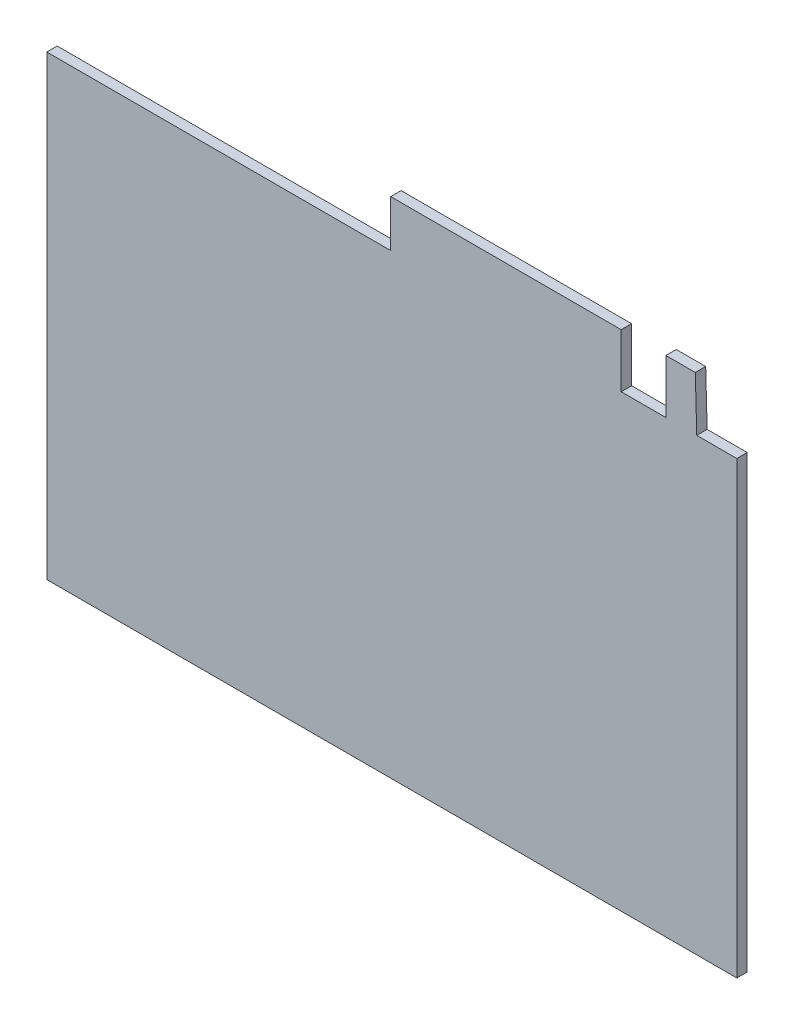
ISO-10303-21;
HEADER;
FILE_DESCRIPTION(('STEP AP214'),'2;1');
FILE_NAME('part.step','',(''),(''),'','','');
FILE_SCHEMA(('AUTOMOTIVE_DESIGN { 1 0 10303 214 1 1 1 1 }'));
ENDSEC;
DATA;
#1=APPLICATION_CONTEXT('core data for automotive mechanical design processes');
#2=APPLICATION_PROTOCOL_DEFINITION('international standard','automotive_design',2000,#1);
#3=PRODUCT_CONTEXT('',#1,'mechanical');
#4=PRODUCT('Part','Part','',(#3));
#5=PRODUCT_RELATED_PRODUCT_CATEGORY('part','',(#4));
#6=PRODUCT_DEFINITION_FORMATION('','',#4);
#7=PRODUCT_DEFINITION_CONTEXT('part definition',#1,'design');
#8=PRODUCT_DEFINITION('design','',#6,#7);
#9=PRODUCT_DEFINITION_SHAPE('','',#8);
#10=(LENGTH_UNIT() NAMED_UNIT(*) SI_UNIT(.MILLI.,.METRE.));
#11=(NAMED_UNIT(*) PLANE_ANGLE_UNIT() SI_UNIT($,.RADIAN.));
#12=(NAMED_UNIT(*) SI_UNIT($,.STERADIAN.) SOLID_ANGLE_UNIT());
#13=UNCERTAINTY_MEASURE_WITH_UNIT(LENGTH_MEASURE(1.E-05),#10,'distance_accuracy_value','');
#14=(GEOMETRIC_REPRESENTATION_CONTEXT(3) GLOBAL_UNCERTAINTY_ASSIGNED_CONTEXT((#13)) GLOBAL_UNIT_ASSIGNED_CONTEXT((#10,
#11,#12)) REPRESENTATION_CONTEXT('',''));
#15=CARTESIAN_POINT('',(0.,0.,0.));
#16=DIRECTION('',(0.,0.,1.));
#17=DIRECTION('',(1.,0.,0.));
#18=AXIS2_PLACEMENT_3D('',#15,#16,#17);
#19=CARTESIAN_POINT('',(28.5714285714286,236.06020224505,6.));
#20=DIRECTION('',(-1.,0.,0.));
#21=DIRECTION('',(0.,0.,1.));
#22=AXIS2_PLACEMENT_3D('',#19,#20,#21);
#23=PLANE('',#22);
#24=DIRECTION('',(0.,1.,0.));
#25=VECTOR('',#24,1.);
#26=CARTESIAN_POINT('',(28.5714285714286,236.06020224505,0.));
#27=LINE('',#26,#25);
#28=CARTESIAN_POINT('',(28.5714285714282,-22.8952380952381,0.));
#29=VERTEX_POINT('',#28);
#30=CARTESIAN_POINT('',(28.5714285714286,237.051840480238,0.));
#31=VERTEX_POINT('',#30);
#32=EDGE_CURVE('E96',#29,#31,#27,.T.);
#33=ORIENTED_EDGE('',*,*,#32,.T.);
#34=DIRECTION('',(0.,0.,-1.));
#35=VECTOR('',#34,1.);
#36=CARTESIAN_POINT('',(28.5714285714286,237.051840480238,6.));
#37=LINE('',#36,#35);
#38=CARTESIAN_POINT('',(28.5714285714286,237.051840480238,6.));
#39=VERTEX_POINT('',#38);
#40=EDGE_CURVE('E11',#39,#31,#37,.T.);
#41=ORIENTED_EDGE('',*,*,#40,.F.);
#42=DIRECTION('',(0.,1.,0.));
#43=VECTOR('',#42,1.);
#44=CARTESIAN_POINT('',(28.5714285714282,-22.8952380952381,6.));
#45=LINE('',#44,#43);
#46=CARTESIAN_POINT('',(28.5714285714282,-22.8952380952381,6.));
#47=VERTEX_POINT('',#46);
#48=EDGE_CURVE('E102',#47,#39,#45,.T.);
#49=ORIENTED_EDGE('',*,*,#48,.F.);
#50=DIRECTION('',(0.,0.,-1.));
#51=VECTOR('',#50,1.);
#52=CARTESIAN_POINT('',(28.5714285714282,-22.8952380952381,6.));
#53=LINE('',#52,#51);
#54=EDGE_CURVE('E148',#47,#29,#53,.T.);
#55=ORIENTED_EDGE('',*,*,#54,.T.);
#56=EDGE_LOOP('',(#33,#41,#49,#55));
#57=FACE_BOUND('',#56,.T.);
#58=ADVANCED_FACE('F32',(#57),#23,.F.);
#59=CARTESIAN_POINT('',(28.5714285714286,237.051840480238,6.));
#60=DIRECTION('',(0.,-1.,0.));
#61=DIRECTION('',(0.,0.,-1.));
#62=AXIS2_PLACEMENT_3D('',#59,#60,#61);
#63=PLANE('',#62);
#64=DIRECTION('',(-1.,0.,0.));
#65=VECTOR('',#64,1.);
#66=CARTESIAN_POINT('',(28.5714285714286,237.051840480238,0.));
#67=LINE('',#66,#65);
#68=CARTESIAN_POINT('',(5.41548643614652,237.051840480238,0.));
#69=VERTEX_POINT('',#68);
#70=EDGE_CURVE('E153',#31,#69,#67,.T.);
#71=ORIENTED_EDGE('',*,*,#70,.T.);
#72=DIRECTION('',(0.,0.,-1.));
#73=VECTOR('',#72,1.);
#74=CARTESIAN_POINT('',(5.41548643614652,237.051840480238,6.));
#75=LINE('',#74,#73);
#76=CARTESIAN_POINT('',(5.41548643614652,237.051840480238,6.));
#77=VERTEX_POINT('',#76);
#78=EDGE_CURVE('E40',#77,#69,#75,.T.);
#79=ORIENTED_EDGE('',*,*,#78,.F.);
#80=DIRECTION('',(-1.,0.,0.));
#81=VECTOR('',#80,1.);
#82=CARTESIAN_POINT('',(28.5714285714286,237.051840480238,6.));
#83=LINE('',#82,#81);
#84=EDGE_CURVE('E241',#39,#77,#83,.T.);
#85=ORIENTED_EDGE('',*,*,#84,.F.);
#86=ORIENTED_EDGE('',*,*,#40,.T.);
#87=EDGE_LOOP('',(#71,#79,#85,#86));
#88=FACE_BOUND('',#87,.T.);
#89=ADVANCED_FACE('F244',(#88),#63,.F.);
#90=CARTESIAN_POINT('',(5.41548643614652,237.051840480238,6.));
#91=DIRECTION('',(-0.99963079383079,-0.0271712352539165,0.));
#92=DIRECTION('',(0.0271712352539165,-0.99963079383079,0.));
#93=AXIS2_PLACEMENT_3D('',#90,#91,#92);
#94=PLANE('',#93);
#95=DIRECTION('',(-0.0271712352539165,0.999630793830791,0.));
#96=VECTOR('',#95,1.);
#97=CARTESIAN_POINT('',(5.41548643614652,237.051840480238,0.));
#98=LINE('',#97,#96);
#99=CARTESIAN_POINT('',(4.57142857142857,268.104761904762,0.));
#100=VERTEX_POINT('',#99);
#101=EDGE_CURVE('E155',#69,#100,#98,.T.);
#102=ORIENTED_EDGE('',*,*,#101,.T.);
#103=DIRECTION('',(0.,0.,-1.));
#104=VECTOR('',#103,1.);
#105=CARTESIAN_POINT('',(4.57142857142857,268.104761904762,6.));
#106=LINE('',#105,#104);
#107=CARTESIAN_POINT('',(4.57142857142857,268.104761904762,6.));
#108=VERTEX_POINT('',#107);
#109=EDGE_CURVE('E192',#108,#100,#106,.T.);
#110=ORIENTED_EDGE('',*,*,#109,.F.);
#111=DIRECTION('',(-0.0271712352539165,0.999630793830791,0.));
#112=VECTOR('',#111,1.);
#113=CARTESIAN_POINT('',(5.41548643614652,237.051840480238,6.));
#114=LINE('',#113,#112);
#115=EDGE_CURVE('E201',#77,#108,#114,.T.);
#116=ORIENTED_EDGE('',*,*,#115,.F.);
#117=ORIENTED_EDGE('',*,*,#78,.T.);
#118=EDGE_LOOP('',(#102,#110,#116,#117));
#119=FACE_BOUND('',#118,.T.);
#120=ADVANCED_FACE('F199',(#119),#94,.F.);
#121=CARTESIAN_POINT('',(4.57142857142857,268.104761904762,6.));
#122=DIRECTION('',(0.,-1.,0.));
#123=DIRECTION('',(0.,0.,-1.));
#124=AXIS2_PLACEMENT_3D('',#121,#122,#123);
#125=PLANE('',#124);
#126=DIRECTION('',(-1.,0.,0.));
#127=VECTOR('',#126,1.);
#128=CARTESIAN_POINT('',(4.57142857142857,268.104761904762,0.));
#129=LINE('',#128,#127);
#130=CARTESIAN_POINT('',(-12.4285714285714,268.104761904762,0.));
#131=VERTEX_POINT('',#130);
#132=EDGE_CURVE('E157',#100,#131,#129,.T.);
#133=ORIENTED_EDGE('',*,*,#132,.T.);
#134=DIRECTION('',(0.,0.,-1.));
#135=VECTOR('',#134,1.);
#136=CARTESIAN_POINT('',(-12.4285714285714,268.104761904762,6.));
#137=LINE('',#136,#135);
#138=CARTESIAN_POINT('',(-12.4285714285714,268.104761904762,6.));
#139=VERTEX_POINT('',#138);
#140=EDGE_CURVE('E189',#139,#131,#137,.T.);
#141=ORIENTED_EDGE('',*,*,#140,.F.);
#142=DIRECTION('',(-1.,0.,0.));
#143=VECTOR('',#142,1.);
#144=CARTESIAN_POINT('',(4.57142857142857,268.104761904762,6.));
#145=LINE('',#144,#143);
#146=EDGE_CURVE('E219',#108,#139,#145,.T.);
#147=ORIENTED_EDGE('',*,*,#146,.F.);
#148=ORIENTED_EDGE('',*,*,#109,.T.);
#149=EDGE_LOOP('',(#133,#141,#147,#148));
#150=FACE_BOUND('',#149,.T.);
#151=ADVANCED_FACE('F210',(#150),#125,.F.);
#152=CARTESIAN_POINT('',(-12.4285714285714,268.104761904762,6.));
#153=DIRECTION('',(1.,0.,0.));
#154=DIRECTION('',(0.,0.,-1.));
#155=AXIS2_PLACEMENT_3D('',#152,#153,#154);
#156=PLANE('',#155);
#157=DIRECTION('',(0.,-1.,0.));
#158=VECTOR('',#157,1.);
#159=CARTESIAN_POINT('',(-12.4285714285714,268.104761904762,0.));
#160=LINE('',#159,#158);
#161=CARTESIAN_POINT('',(-12.4285714285714,237.051840480238,0.));
#162=VERTEX_POINT('',#161);
#163=EDGE_CURVE('E159',#131,#162,#160,.T.);
#164=ORIENTED_EDGE('',*,*,#163,.T.);
#165=DIRECTION('',(0.,0.,-1.));
#166=VECTOR('',#165,1.);
#167=CARTESIAN_POINT('',(-12.4285714285714,237.051840480238,6.));
#168=LINE('',#167,#166);
#169=CARTESIAN_POINT('',(-12.4285714285714,237.051840480238,6.));
#170=VERTEX_POINT('',#169);
#171=EDGE_CURVE('E186',#170,#162,#168,.T.);
#172=ORIENTED_EDGE('',*,*,#171,.F.);
#173=DIRECTION('',(0.,-1.,0.));
#174=VECTOR('',#173,1.);
#175=CARTESIAN_POINT('',(-12.4285714285714,268.104761904762,6.));
#176=LINE('',#175,#174);
#177=EDGE_CURVE('E216',#139,#170,#176,.T.);
#178=ORIENTED_EDGE('',*,*,#177,.F.);
#179=ORIENTED_EDGE('',*,*,#140,.T.);
#180=EDGE_LOOP('',(#164,#172,#178,#179));
#181=FACE_BOUND('',#180,.T.);
#182=ADVANCED_FACE('F214',(#181),#156,.F.);
#183=CARTESIAN_POINT('',(-12.4285714285714,237.051840480238,6.));
#184=DIRECTION('',(0.,-1.,0.));
#185=DIRECTION('',(0.,0.,-1.));
#186=AXIS2_PLACEMENT_3D('',#183,#184,#185);
#187=PLANE('',#186);
#188=DIRECTION('',(-1.,0.,0.));
#189=VECTOR('',#188,1.);
#190=CARTESIAN_POINT('',(-12.4285714285714,237.051840480238,0.));
#191=LINE('',#190,#189);
#192=CARTESIAN_POINT('',(-38.2165959121275,237.051840480238,0.));
#193=VERTEX_POINT('',#192);
#194=EDGE_CURVE('E161',#162,#193,#191,.T.);
#195=ORIENTED_EDGE('',*,*,#194,.T.);
#196=DIRECTION('',(0.,0.,-1.));
#197=VECTOR('',#196,1.);
#198=CARTESIAN_POINT('',(-38.2165959121275,237.051840480238,6.));
#199=LINE('',#198,#197);
#200=CARTESIAN_POINT('',(-38.2165959121275,237.051840480238,6.));
#201=VERTEX_POINT('',#200);
#202=EDGE_CURVE('E183',#201,#193,#199,.T.);
#203=ORIENTED_EDGE('',*,*,#202,.F.);
#204=DIRECTION('',(-1.,0.,0.));
#205=VECTOR('',#204,1.);
#206=CARTESIAN_POINT('',(-12.4285714285714,237.051840480238,6.));
#207=LINE('',#206,#205);
#208=EDGE_CURVE('E218',#170,#201,#207,.T.);
#209=ORIENTED_EDGE('',*,*,#208,.F.);
#210=ORIENTED_EDGE('',*,*,#171,.T.);
#211=EDGE_LOOP('',(#195,#203,#209,#210));
#212=FACE_BOUND('',#211,.T.);
#213=ADVANCED_FACE('F256',(#212),#187,.F.);
#214=CARTESIAN_POINT('',(-38.2165959121275,237.051840480238,6.));
#215=DIRECTION('',(-1.,0.,0.));
#216=DIRECTION('',(0.,-1.,0.));
#217=AXIS2_PLACEMENT_3D('',#214,#215,#216);
#218=PLANE('',#217);
#219=DIRECTION('',(0.,1.,0.));
#220=VECTOR('',#219,1.);
#221=CARTESIAN_POINT('',(-38.2165959121275,237.051840480238,0.));
#222=LINE('',#221,#220);
#223=CARTESIAN_POINT('',(-38.2165959121275,268.104761904762,0.));
#224=VERTEX_POINT('',#223);
#225=EDGE_CURVE('E163',#193,#224,#222,.T.);
#226=ORIENTED_EDGE('',*,*,#225,.T.);
#227=DIRECTION('',(0.,0.,-1.));
#228=VECTOR('',#227,1.);
#229=CARTESIAN_POINT('',(-38.2165959121275,268.104761904762,6.));
#230=LINE('',#229,#228);
#231=CARTESIAN_POINT('',(-38.2165959121275,268.104761904762,6.));
#232=VERTEX_POINT('',#231);
#233=EDGE_CURVE('E180',#232,#224,#230,.T.);
#234=ORIENTED_EDGE('',*,*,#233,.F.);
#235=DIRECTION('',(0.,1.,0.));
#236=VECTOR('',#235,1.);
#237=CARTESIAN_POINT('',(-38.2165959121275,237.051840480238,6.));
#238=LINE('',#237,#236);
#239=EDGE_CURVE('E221',#201,#232,#238,.T.);
#240=ORIENTED_EDGE('',*,*,#239,.F.);
#241=ORIENTED_EDGE('',*,*,#202,.T.);
#242=EDGE_LOOP('',(#226,#234,#240,#241));
#243=FACE_BOUND('',#242,.T.);
#244=ADVANCED_FACE('F259',(#243),#218,.F.);
#245=CARTESIAN_POINT('',(-38.2165959121275,268.104761904762,6.));
#246=DIRECTION('',(0.,-1.,0.));
#247=DIRECTION('',(1.,0.,0.));
#248=AXIS2_PLACEMENT_3D('',#245,#246,#247);
#249=PLANE('',#248);
#250=DIRECTION('',(-1.,0.,0.));
#251=VECTOR('',#250,1.);
#252=CARTESIAN_POINT('',(-38.2165959121275,268.104761904762,0.));
#253=LINE('',#252,#251);
#254=CARTESIAN_POINT('',(-171.428571428571,268.104761904762,0.));
#255=VERTEX_POINT('',#254);
#256=EDGE_CURVE('E165',#224,#255,#253,.T.);
#257=ORIENTED_EDGE('',*,*,#256,.T.);
#258=DIRECTION('',(0.,0.,-1.));
#259=VECTOR('',#258,1.);
#260=CARTESIAN_POINT('',(-171.428571428571,268.104761904762,6.));
#261=LINE('',#260,#259);
#262=CARTESIAN_POINT('',(-171.428571428571,268.104761904762,6.));
#263=VERTEX_POINT('',#262);
#264=EDGE_CURVE('E177',#263,#255,#261,.T.);
#265=ORIENTED_EDGE('',*,*,#264,.F.);
#266=DIRECTION('',(-1.,0.,0.));
#267=VECTOR('',#266,1.);
#268=CARTESIAN_POINT('',(-38.2165959121275,268.104761904762,6.));
#269=LINE('',#268,#267);
#270=EDGE_CURVE('E227',#232,#263,#269,.T.);
#271=ORIENTED_EDGE('',*,*,#270,.F.);
#272=ORIENTED_EDGE('',*,*,#233,.T.);
#273=EDGE_LOOP('',(#257,#265,#271,#272));
#274=FACE_BOUND('',#273,.T.);
#275=ADVANCED_FACE('F233',(#274),#249,.F.);
#276=CARTESIAN_POINT('',(-171.428571428571,268.104761904762,6.));
#277=DIRECTION('',(1.,0.,0.));
#278=DIRECTION('',(0.,1.,0.));
#279=AXIS2_PLACEMENT_3D('',#276,#277,#278);
#280=PLANE('',#279);
#281=DIRECTION('',(0.,-1.,0.));
#282=VECTOR('',#281,1.);
#283=CARTESIAN_POINT('',(-171.428571428571,268.104761904762,0.));
#284=LINE('',#283,#282);
#285=CARTESIAN_POINT('',(-171.428571428571,241.104761904762,0.));
#286=VERTEX_POINT('',#285);
#287=EDGE_CURVE('E167',#255,#286,#284,.T.);
#288=ORIENTED_EDGE('',*,*,#287,.T.);
#289=DIRECTION('',(0.,0.,-1.));
#290=VECTOR('',#289,1.);
#291=CARTESIAN_POINT('',(-171.428571428571,241.104761904762,6.));
#292=LINE('',#291,#290);
#293=CARTESIAN_POINT('',(-171.428571428571,241.104761904762,6.));
#294=VERTEX_POINT('',#293);
#295=EDGE_CURVE('E143',#294,#286,#292,.T.);
#296=ORIENTED_EDGE('',*,*,#295,.F.);
#297=DIRECTION('',(0.,-1.,0.));
#298=VECTOR('',#297,1.);
#299=CARTESIAN_POINT('',(-171.428571428571,268.104761904762,6.));
#300=LINE('',#299,#298);
#301=EDGE_CURVE('E134',#263,#294,#300,.T.);
#302=ORIENTED_EDGE('',*,*,#301,.F.);
#303=ORIENTED_EDGE('',*,*,#264,.T.);
#304=EDGE_LOOP('',(#288,#296,#302,#303));
#305=FACE_BOUND('',#304,.T.);
#306=ADVANCED_FACE('F237',(#305),#280,.F.);
#307=CARTESIAN_POINT('',(-171.428571428571,241.104761904762,6.));
#308=DIRECTION('',(0.,-1.,0.));
#309=DIRECTION('',(1.,0.,0.));
#310=AXIS2_PLACEMENT_3D('',#307,#308,#309);
#311=PLANE('',#310);
#312=DIRECTION('',(-1.,0.,0.));
#313=VECTOR('',#312,1.);
#314=CARTESIAN_POINT('',(-171.428571428571,241.104761904762,0.));
#315=LINE('',#314,#313);
#316=CARTESIAN_POINT('',(-370.123537573958,241.104761904762,0.));
#317=VERTEX_POINT('',#316);
#318=EDGE_CURVE('E142',#286,#317,#315,.T.);
#319=ORIENTED_EDGE('',*,*,#318,.T.);
#320=DIRECTION('',(0.,0.,-1.));
#321=VECTOR('',#320,1.);
#322=CARTESIAN_POINT('',(-370.123537573958,241.104761904762,6.));
#323=LINE('',#322,#321);
#324=CARTESIAN_POINT('',(-370.123537573958,241.104761904762,6.));
#325=VERTEX_POINT('',#324);
#326=EDGE_CURVE('E139',#325,#317,#323,.T.);
#327=ORIENTED_EDGE('',*,*,#326,.F.);
#328=DIRECTION('',(-1.,0.,0.));
#329=VECTOR('',#328,1.);
#330=CARTESIAN_POINT('',(-171.428571428571,241.104761904762,6.));
#331=LINE('',#330,#329);
#332=EDGE_CURVE('E128',#294,#325,#331,.T.);
#333=ORIENTED_EDGE('',*,*,#332,.F.);
#334=ORIENTED_EDGE('',*,*,#295,.T.);
#335=EDGE_LOOP('',(#319,#327,#333,#334));
#336=FACE_BOUND('',#335,.T.);
#337=ADVANCED_FACE('F140',(#336),#311,.F.);
#338=CARTESIAN_POINT('',(-370.123537573958,241.104761904762,6.));
#339=DIRECTION('',(1.,0.,0.));
#340=DIRECTION('',(0.,1.,0.));
#341=AXIS2_PLACEMENT_3D('',#338,#339,#340);
#342=PLANE('',#341);
#343=DIRECTION('',(0.,-1.,0.));
#344=VECTOR('',#343,1.);
#345=CARTESIAN_POINT('',(-370.123537573958,241.104761904762,0.));
#346=LINE('',#345,#344);
#347=CARTESIAN_POINT('',(-370.123537573958,-22.8952380952382,0.));
#348=VERTEX_POINT('',#347);
#349=EDGE_CURVE('E89',#317,#348,#346,.T.);
#350=ORIENTED_EDGE('',*,*,#349,.T.);
#351=DIRECTION('',(0.,0.,-1.));
#352=VECTOR('',#351,1.);
#353=CARTESIAN_POINT('',(-370.123537573958,-22.8952380952382,6.));
#354=LINE('',#353,#352);
#355=CARTESIAN_POINT('',(-370.123537573958,-22.8952380952382,6.));
#356=VERTEX_POINT('',#355);
#357=EDGE_CURVE('E144',#356,#348,#354,.T.);
#358=ORIENTED_EDGE('',*,*,#357,.F.);
#359=DIRECTION('',(0.,-1.,0.));
#360=VECTOR('',#359,1.);
#361=CARTESIAN_POINT('',(-370.123537573958,241.104761904762,6.));
#362=LINE('',#361,#360);
#363=EDGE_CURVE('E132',#325,#356,#362,.T.);
#364=ORIENTED_EDGE('',*,*,#363,.F.);
#365=ORIENTED_EDGE('',*,*,#326,.T.);
#366=EDGE_LOOP('',(#350,#358,#364,#365));
#367=FACE_BOUND('',#366,.T.);
#368=ADVANCED_FACE('F146',(#367),#342,.F.);
#369=CARTESIAN_POINT('',(-370.123537573958,-22.8952380952382,6.));
#370=DIRECTION('',(0.,1.,0.));
#371=DIRECTION('',(-1.,0.,0.));
#372=AXIS2_PLACEMENT_3D('',#369,#370,#371);
#373=PLANE('',#372);
#374=DIRECTION('',(1.,0.,0.));
#375=VECTOR('',#374,1.);
#376=CARTESIAN_POINT('',(-370.123537573958,-22.8952380952382,0.));
#377=LINE('',#376,#375);
#378=EDGE_CURVE('E171',#348,#29,#377,.T.);
#379=ORIENTED_EDGE('',*,*,#378,.T.);
#380=ORIENTED_EDGE('',*,*,#54,.F.);
#381=DIRECTION('',(1.,0.,0.));
#382=VECTOR('',#381,1.);
#383=CARTESIAN_POINT('',(-370.123537573958,-22.8952380952382,6.));
#384=LINE('',#383,#382);
#385=EDGE_CURVE('E48',#356,#47,#384,.T.);
#386=ORIENTED_EDGE('',*,*,#385,.F.);
#387=ORIENTED_EDGE('',*,*,#357,.T.);
#388=EDGE_LOOP('',(#379,#380,#386,#387));
#389=FACE_BOUND('',#388,.T.);
#390=ADVANCED_FACE('F239',(#389),#373,.F.);
#391=CARTESIAN_POINT('',(0.,0.,6.));
#392=DIRECTION('',(0.,0.,1.));
#393=DIRECTION('',(1.,0.,0.));
#394=AXIS2_PLACEMENT_3D('',#391,#392,#393);
#395=PLANE('',#394);
#396=ORIENTED_EDGE('',*,*,#48,.T.);
#397=ORIENTED_EDGE('',*,*,#84,.T.);
#398=ORIENTED_EDGE('',*,*,#115,.T.);
#399=ORIENTED_EDGE('',*,*,#146,.T.);
#400=ORIENTED_EDGE('',*,*,#177,.T.);
#401=ORIENTED_EDGE('',*,*,#208,.T.);
#402=ORIENTED_EDGE('',*,*,#239,.T.);
#403=ORIENTED_EDGE('',*,*,#270,.T.);
#404=ORIENTED_EDGE('',*,*,#301,.T.);
#405=ORIENTED_EDGE('',*,*,#332,.T.);
#406=ORIENTED_EDGE('',*,*,#363,.T.);
#407=ORIENTED_EDGE('',*,*,#385,.T.);
#408=EDGE_LOOP('',(#396,#397,#398,#399,#400,#401,#402,#403,#404,#405,#406,#407));
#409=FACE_BOUND('',#408,.T.);
#410=ADVANCED_FACE('F130',(#409),#395,.T.);
#411=CARTESIAN_POINT('',(0.,0.,0.));
#412=DIRECTION('',(0.,0.,1.));
#413=DIRECTION('',(1.,0.,0.));
#414=AXIS2_PLACEMENT_3D('',#411,#412,#413);
#415=PLANE('',#414);
#416=ORIENTED_EDGE('',*,*,#32,.F.);
#417=ORIENTED_EDGE('',*,*,#378,.F.);
#418=ORIENTED_EDGE('',*,*,#349,.F.);
#419=ORIENTED_EDGE('',*,*,#318,.F.);
#420=ORIENTED_EDGE('',*,*,#287,.F.);
#421=ORIENTED_EDGE('',*,*,#256,.F.);
#422=ORIENTED_EDGE('',*,*,#225,.F.);
#423=ORIENTED_EDGE('',*,*,#194,.F.);
#424=ORIENTED_EDGE('',*,*,#163,.F.);
#425=ORIENTED_EDGE('',*,*,#132,.F.);
#426=ORIENTED_EDGE('',*,*,#101,.F.);
#427=ORIENTED_EDGE('',*,*,#70,.F.);
#428=EDGE_LOOP('',(#416,#417,#418,#419,#420,#421,#422,#423,#424,#425,#426,#427));
#429=FACE_BOUND('',#428,.T.);
#430=ADVANCED_FACE('F205',(#429),#415,.F.);
#431=CLOSED_SHELL('',(#58,#89,#120,#151,#182,#213,#244,#275,#306,#337,#368,#390,#410,#430));
#432=MANIFOLD_SOLID_BREP('B2',#431);
#433=ADVANCED_BREP_SHAPE_REPRESENTATION('',(#18,#432),#14);
#434=SHAPE_DEFINITION_REPRESENTATION(#9,#433);
ENDSEC;
END-ISO-10303-21;
